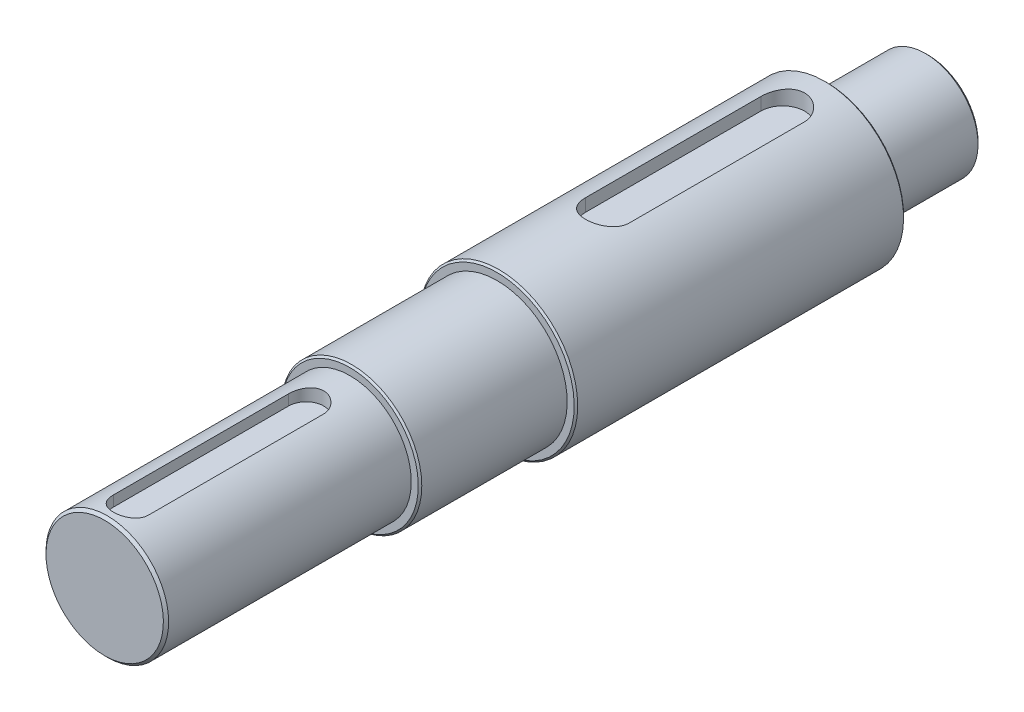
ISO-10303-21;
HEADER;
FILE_DESCRIPTION(('STEP AP214'),'2;1');
FILE_NAME('part.step','',(''),(''),'','','');
FILE_SCHEMA(('AUTOMOTIVE_DESIGN { 1 0 10303 214 1 1 1 1 }'));
ENDSEC;
DATA;
#1=APPLICATION_CONTEXT('core data for automotive mechanical design processes');
#2=APPLICATION_PROTOCOL_DEFINITION('international standard','automotive_design',2000,#1);
#3=PRODUCT_CONTEXT('',#1,'mechanical');
#4=PRODUCT('Part','Part','',(#3));
#5=PRODUCT_RELATED_PRODUCT_CATEGORY('part','',(#4));
#6=PRODUCT_DEFINITION_FORMATION('','',#4);
#7=PRODUCT_DEFINITION_CONTEXT('part definition',#1,'design');
#8=PRODUCT_DEFINITION('design','',#6,#7);
#9=PRODUCT_DEFINITION_SHAPE('','',#8);
#10=(LENGTH_UNIT() NAMED_UNIT(*) SI_UNIT(.MILLI.,.METRE.));
#11=(NAMED_UNIT(*) PLANE_ANGLE_UNIT() SI_UNIT($,.RADIAN.));
#12=(NAMED_UNIT(*) SI_UNIT($,.STERADIAN.) SOLID_ANGLE_UNIT());
#13=UNCERTAINTY_MEASURE_WITH_UNIT(LENGTH_MEASURE(1.E-05),#10,'distance_accuracy_value','');
#14=(GEOMETRIC_REPRESENTATION_CONTEXT(3) GLOBAL_UNCERTAINTY_ASSIGNED_CONTEXT((#13)) GLOBAL_UNIT_ASSIGNED_CONTEXT((#10,
#11,#12)) REPRESENTATION_CONTEXT('',''));
#15=CARTESIAN_POINT('',(0.,0.,0.));
#16=DIRECTION('',(0.,0.,1.));
#17=DIRECTION('',(1.,0.,0.));
#18=AXIS2_PLACEMENT_3D('',#15,#16,#17);
#19=CARTESIAN_POINT('',(0.,0.,-470.));
#20=DIRECTION('',(0.,0.,-1.));
#21=DIRECTION('',(0.,1.,0.));
#22=AXIS2_PLACEMENT_3D('',#19,#20,#21);
#23=CYLINDRICAL_SURFACE('',#22,44.9999999999999);
#24=CARTESIAN_POINT('',(0.,0.,-411.));
#25=DIRECTION('',(0.,0.,-1.));
#26=DIRECTION('',(0.,1.,0.));
#27=AXIS2_PLACEMENT_3D('',#24,#25,#26);
#28=CIRCLE('',#27,44.9999999999999);
#29=CARTESIAN_POINT('',(0.,45.,-411.));
#30=VERTEX_POINT('',#29);
#31=EDGE_CURVE('E301',#30,#30,#28,.F.);
#32=ORIENTED_EDGE('',*,*,#31,.T.);
#33=EDGE_LOOP('',(#32));
#34=FACE_BOUND('',#33,.T.);
#35=CARTESIAN_POINT('',(0.,0.,-225.));
#36=DIRECTION('',(0.,0.,1.));
#37=DIRECTION('',(0.,-1.,0.));
#38=AXIS2_PLACEMENT_3D('',#35,#36,#37);
#39=CIRCLE('',#38,44.9999999999999);
#40=CARTESIAN_POINT('',(0.,-44.9999999999999,-225.));
#41=VERTEX_POINT('',#40);
#42=EDGE_CURVE('E297',#41,#41,#39,.F.);
#43=ORIENTED_EDGE('',*,*,#42,.T.);
#44=EDGE_LOOP('',(#43));
#45=FACE_BOUND('',#44,.T.);
#46=DIRECTION('',(0.,0.,-1.));
#47=VECTOR('',#46,1.);
#48=CARTESIAN_POINT('',(-12.5,43.2290411644764,-470.));
#49=LINE('',#48,#47);
#50=CARTESIAN_POINT('',(-12.5,43.2290411644764,-287.));
#51=VERTEX_POINT('',#50);
#52=CARTESIAN_POINT('',(-12.5,43.2290411644764,-387.));
#53=VERTEX_POINT('',#52);
#54=EDGE_CURVE('E253',#51,#53,#49,.T.);
#55=ORIENTED_EDGE('',*,*,#54,.T.);
#56=CARTESIAN_POINT('',(-12.5,43.2290411644764,-387.));
#57=CARTESIAN_POINT('',(-12.500045240691,43.2289961808989,-387.344286160492));
#58=CARTESIAN_POINT('',(-12.4857780852814,43.2331526093881,-387.688556281799));
#59=CARTESIAN_POINT('',(-12.4289529612534,43.2495403215527,-388.374494130724));
#60=CARTESIAN_POINT('',(-12.3864005976549,43.261770005422,-388.716162360369));
#61=CARTESIAN_POINT('',(-12.2734671845474,43.2939399271419,-389.393694228693));
#62=CARTESIAN_POINT('',(-12.2031495583828,43.3138625898821,-389.729569288213));
#63=CARTESIAN_POINT('',(-12.0353031723932,43.3608015819289,-390.393943528582));
#64=CARTESIAN_POINT('',(-11.9377738607429,43.3878180550901,-390.722442559706));
#65=CARTESIAN_POINT('',(-11.7163375218914,43.4481365646167,-391.369715045171));
#66=CARTESIAN_POINT('',(-11.5924382803264,43.4814367454096,-391.688491338428));
#67=CARTESIAN_POINT('',(-11.3192063982575,43.5533639847889,-392.314335168257));
#68=CARTESIAN_POINT('',(-11.1698726730095,43.5919912705554,-392.621402204762));
#69=CARTESIAN_POINT('',(-10.8468207159485,43.6734956770882,-393.221959321005));
#70=CARTESIAN_POINT('',(-10.6730947977984,43.7163741362051,-393.515445082174));
#71=CARTESIAN_POINT('',(-10.3024966888676,43.8051921305476,-394.086928305757));
#72=CARTESIAN_POINT('',(-10.1056241324873,43.8511317141186,-394.364925523428));
#73=CARTESIAN_POINT('',(-9.68499948312222,43.9459709868199,-394.910259724889));
#74=CARTESIAN_POINT('',(-9.46071276593183,43.994915382457,-395.177176708216));
#75=CARTESIAN_POINT('',(-8.99059673451083,44.0933879144002,-395.691408820648));
#76=CARTESIAN_POINT('',(-8.74475811115383,44.1429162948785,-395.938715390523));
#77=CARTESIAN_POINT('',(-8.23315305431616,44.2411916236806,-396.412048421034));
#78=CARTESIAN_POINT('',(-7.9673830944861,44.2899384318642,-396.638071099988));
#79=CARTESIAN_POINT('',(-7.4177678485958,44.3852955993302,-397.06718531759));
#80=CARTESIAN_POINT('',(-7.13393069608662,44.431906903954,-397.270287062261));
#81=CARTESIAN_POINT('',(-6.54469120547241,44.5225495873953,-397.655661925901));
#82=CARTESIAN_POINT('',(-6.23899530592892,44.5665204111392,-397.83750084439));
#83=CARTESIAN_POINT('',(-5.61270553474492,44.6497179492803,-398.174704569497));
#84=CARTESIAN_POINT('',(-5.29211143501657,44.6889445910121,-398.330068970626));
#85=CARTESIAN_POINT('',(-4.6383234515605,44.7615247379244,-398.613044657932));
#86=CARTESIAN_POINT('',(-4.30513194450377,44.7948793442934,-398.740661148757));
#87=CARTESIAN_POINT('',(-3.62850440804102,44.8547576556818,-398.967088939055));
#88=CARTESIAN_POINT('',(-3.2850686767247,44.8812815592472,-399.065901075786));
#89=CARTESIAN_POINT('',(-2.59911476303481,44.926159441948,-399.231762663092));
#90=CARTESIAN_POINT('',(-2.25678402117027,44.9446992827699,-399.299537333787));
#91=CARTESIAN_POINT('',(-1.56732778649449,44.9740205084003,-399.406254879431));
#92=CARTESIAN_POINT('',(-1.22020236522849,44.9848020088499,-399.445198184122));
#93=CARTESIAN_POINT('',(-0.523800772346508,44.9982989216423,-399.493896688356));
#94=CARTESIAN_POINT('',(-0.174524898752593,45.0010154275398,-399.503655845058));
#95=CARTESIAN_POINT('',(0.523583603734409,44.9983076700296,-399.493907196579));
#96=CARTESIAN_POINT('',(0.872416239430775,44.9928835331213,-399.474399846177));
#97=CARTESIAN_POINT('',(1.55748614050236,44.9743086194663,-399.407233245157));
#98=CARTESIAN_POINT('',(1.89380666555369,44.9613735804177,-399.360359840037));
#99=CARTESIAN_POINT('',(2.56117121562254,44.9282986410243,-399.239501380676));
#100=CARTESIAN_POINT('',(2.8922153535257,44.9081588950373,-399.165516907278));
#101=CARTESIAN_POINT('',(3.54676340808957,44.8612097813299,-398.991046435018));
#102=CARTESIAN_POINT('',(3.87026713210312,44.8344002434093,-398.890559759868));
#103=CARTESIAN_POINT('',(4.50757291428368,44.7748168949959,-398.66388347612));
#104=CARTESIAN_POINT('',(4.82137480937625,44.7420429843139,-398.537693435754));
#105=CARTESIAN_POINT('',(5.44048981249991,44.6710105665636,-398.259107811735));
#106=CARTESIAN_POINT('',(5.7456789641549,44.6326980122368,-398.106450627146));
#107=CARTESIAN_POINT('',(6.342137185888,44.5518561477928,-397.776983763343));
#108=CARTESIAN_POINT('',(6.63340620193641,44.5093268213106,-397.600173990393));
#109=CARTESIAN_POINT('',(7.20020650483161,44.4211581633888,-397.223638328208));
#110=CARTESIAN_POINT('',(7.4757387403595,44.375519019787,-397.023913822562));
#111=CARTESIAN_POINT('',(8.00953143724535,44.2822860937902,-396.602762094549));
#112=CARTESIAN_POINT('',(8.26778398256613,44.234691431446,-396.38132503838));
#113=CARTESIAN_POINT('',(8.77357773969799,44.1372049033222,-395.910534279091));
#114=CARTESIAN_POINT('',(9.02047977213161,44.0872891973234,-395.660498339081));
#115=CARTESIAN_POINT('',(9.49232627225081,43.9881103893933,-395.140573423772));
#116=CARTESIAN_POINT('',(9.71727958845004,43.9388470314518,-394.87069252646));
#117=CARTESIAN_POINT('',(10.1439446349555,43.8423113827873,-394.312580255748));
#118=CARTESIAN_POINT('',(10.3456443446517,43.7950401297931,-394.024339509954));
#119=CARTESIAN_POINT('',(10.7242436999143,43.7038731079755,-393.43150746412));
#120=CARTESIAN_POINT('',(10.9011441061178,43.659977235642,-393.126916665961));
#121=CARTESIAN_POINT('',(11.2301161302556,43.5765250003751,-392.500951917571));
#122=CARTESIAN_POINT('',(11.3819835257626,43.5370051189538,-392.179465679369));
#123=CARTESIAN_POINT('',(11.6579768534934,43.46391571385,-391.524153528085));
#124=CARTESIAN_POINT('',(11.7821041000084,43.4303459082764,-391.190328200487));
#125=CARTESIAN_POINT('',(12.0014315261798,43.3702499023691,-390.513140713505));
#126=CARTESIAN_POINT('',(12.0966669494724,43.3437151253935,-390.169790735606));
#127=CARTESIAN_POINT('',(12.2575243340772,43.298499567937,-389.475859533639));
#128=CARTESIAN_POINT('',(12.3231600492767,43.2798151399661,-389.125281747421));
#129=CARTESIAN_POINT('',(12.4157443037831,43.2533383842448,-388.478912580948));
#130=CARTESIAN_POINT('',(12.4473450618982,43.2442420695325,-388.183831836571));
#131=CARTESIAN_POINT('',(12.4894673764403,43.2320864061189,-387.592508557323));
#132=CARTESIAN_POINT('',(12.5000216233051,43.2290176951694,-387.296268541427));
#133=CARTESIAN_POINT('',(12.5,43.2290411644764,-387.));
#134=B_SPLINE_CURVE_WITH_KNOTS('',3,(#56,#57,#58,#59,#60,#61,#62,#63,#64,#65,#66,#67,#68,#69,
#70,#71,#72,#73,#74,#75,#76,#77,#78,#79,#80,#81,#82,#83,#84,#85,#86,#87,#88,#89,#90,#91,#92,#93,
#94,#95,#96,#97,#98,#99,#100,#101,#102,#103,#104,#105,#106,#107,#108,#109,#110,#111,#112,#113,
#114,#115,#116,#117,#118,#119,#120,#121,#122,#123,#124,#125,#126,#127,#128,#129,#130,#131,#132,
#133),.UNSPECIFIED.,.F.,.F.,(4,2,2,2,2,2,2,2,2,2,2,2,2,2,2,2,2,2,2,2,2,2,2,2,2,2,2,2,2,2,2,2,2,
2,2,2,2,2,4),(0.,1.03251330399437,2.06482206528686,3.0947862714934,4.12477136583919,
5.15445278123941,6.18417812207147,7.21422867572854,8.24429550115863,9.29925646517971,
10.3546753754125,11.4102814580527,12.4654156399844,13.5392973658636,14.6131955380308,
15.6868921060273,16.7605574616778,17.8076646923354,18.854756315115,19.9017059533918,
20.948639323032,21.966892519181,22.985123900993,24.0033812687566,25.0216557427343,
26.0506374539943,27.0796231588262,28.1085467663373,29.1379385539288,30.2014657415118,
31.2645623864265,32.3282061425056,33.3918172676643,34.4637166658526,35.5355652681109,
36.6061010712407,37.6761389222234,38.5660706036811,39.4546189210757),.UNSPECIFIED.);
#135=CARTESIAN_POINT('',(12.5,43.2290411644764,-387.));
#136=VERTEX_POINT('',#135);
#137=EDGE_CURVE('E120',#53,#136,#134,.T.);
#138=ORIENTED_EDGE('',*,*,#137,.T.);
#139=DIRECTION('',(0.,0.,-1.));
#140=VECTOR('',#139,1.);
#141=CARTESIAN_POINT('',(12.5,43.2290411644764,-470.));
#142=LINE('',#141,#140);
#143=CARTESIAN_POINT('',(12.5,43.2290411644764,-287.));
#144=VERTEX_POINT('',#143);
#145=EDGE_CURVE('E239',#136,#144,#142,.F.);
#146=ORIENTED_EDGE('',*,*,#145,.T.);
#147=CARTESIAN_POINT('',(12.5,43.2290411644764,-287.));
#148=CARTESIAN_POINT('',(12.500045240691,43.2289961808989,-286.655713839508));
#149=CARTESIAN_POINT('',(12.4857780852814,43.233152609388,-286.311443718201));
#150=CARTESIAN_POINT('',(12.4289529612535,43.2495403215527,-285.625505869276));
#151=CARTESIAN_POINT('',(12.3864005976549,43.261770005422,-285.283837639631));
#152=CARTESIAN_POINT('',(12.2734671845474,43.2939399271419,-284.606305771308));
#153=CARTESIAN_POINT('',(12.2031495583829,43.3138625898821,-284.270430711787));
#154=CARTESIAN_POINT('',(12.0353031723932,43.3608015819289,-283.606056471418));
#155=CARTESIAN_POINT('',(11.9377738607429,43.3878180550901,-283.277557440294));
#156=CARTESIAN_POINT('',(11.7163375218914,43.4481365646167,-282.630284954829));
#157=CARTESIAN_POINT('',(11.5924382803264,43.4814367454095,-282.311508661572));
#158=CARTESIAN_POINT('',(11.3192063982575,43.5533639847889,-281.685664831743));
#159=CARTESIAN_POINT('',(11.1698726730095,43.5919912705554,-281.378597795238));
#160=CARTESIAN_POINT('',(10.8468207159485,43.6734956770882,-280.778040678995));
#161=CARTESIAN_POINT('',(10.6730947977984,43.7163741362051,-280.484554917826));
#162=CARTESIAN_POINT('',(10.3024966888677,43.8051921305476,-279.913071694243));
#163=CARTESIAN_POINT('',(10.1056241324873,43.8511317141186,-279.635074476572));
#164=CARTESIAN_POINT('',(9.68499948312223,43.9459709868199,-279.089740275111));
#165=CARTESIAN_POINT('',(9.46071276593185,43.994915382457,-278.822823291784));
#166=CARTESIAN_POINT('',(8.99059673451084,44.0933879144002,-278.308591179352));
#167=CARTESIAN_POINT('',(8.74475811115383,44.1429162948785,-278.061284609477));
#168=CARTESIAN_POINT('',(8.23315305431618,44.2411916236805,-277.587951578966));
#169=CARTESIAN_POINT('',(7.96738309448614,44.2899384318641,-277.361928900012));
#170=CARTESIAN_POINT('',(7.41776784859583,44.3852955993301,-276.93281468241));
#171=CARTESIAN_POINT('',(7.13393069608664,44.4319069039539,-276.729712937739));
#172=CARTESIAN_POINT('',(6.54469120547242,44.5225495873953,-276.344338074099));
#173=CARTESIAN_POINT('',(6.23899530592894,44.5665204111392,-276.16249915561));
#174=CARTESIAN_POINT('',(5.61270553474493,44.6497179492803,-275.825295430503));
#175=CARTESIAN_POINT('',(5.29211143501659,44.6889445910121,-275.669931029374));
#176=CARTESIAN_POINT('',(4.63832345156052,44.7615247379244,-275.386955342068));
#177=CARTESIAN_POINT('',(4.3051319445038,44.7948793442933,-275.259338851243));
#178=CARTESIAN_POINT('',(3.62850440804105,44.8547576556817,-275.032911060945));
#179=CARTESIAN_POINT('',(3.28506867672473,44.8812815592472,-274.934098924214));
#180=CARTESIAN_POINT('',(2.59911476303484,44.926159441948,-274.768237336908));
#181=CARTESIAN_POINT('',(2.2567840211703,44.9446992827699,-274.700462666213));
#182=CARTESIAN_POINT('',(1.56732778649452,44.9740205084003,-274.59374512057));
#183=CARTESIAN_POINT('',(1.22020236522852,44.9848020088498,-274.554801815878));
#184=CARTESIAN_POINT('',(0.523800772346536,44.9982989216422,-274.506103311644));
#185=CARTESIAN_POINT('',(0.174524898752619,45.0010154275397,-274.496344154942));
#186=CARTESIAN_POINT('',(-0.523583603734387,44.9983076700296,-274.506092803421));
#187=CARTESIAN_POINT('',(-0.872416239430753,44.9928835331213,-274.525600153823));
#188=CARTESIAN_POINT('',(-1.55748614050236,44.9743086194663,-274.592766754843));
#189=CARTESIAN_POINT('',(-1.8938066655537,44.9613735804177,-274.639640159963));
#190=CARTESIAN_POINT('',(-2.56117121562255,44.9282986410243,-274.760498619324));
#191=CARTESIAN_POINT('',(-2.89221535352571,44.9081588950373,-274.834483092722));
#192=CARTESIAN_POINT('',(-3.54676340808956,44.8612097813299,-275.008953564982));
#193=CARTESIAN_POINT('',(-3.87026713210311,44.8344002434093,-275.109440240132));
#194=CARTESIAN_POINT('',(-4.50757291428366,44.7748168949959,-275.33611652388));
#195=CARTESIAN_POINT('',(-4.82137480937624,44.7420429843139,-275.462306564246));
#196=CARTESIAN_POINT('',(-5.44048981249989,44.6710105665636,-275.740892188265));
#197=CARTESIAN_POINT('',(-5.74567896415488,44.6326980122368,-275.893549372854));
#198=CARTESIAN_POINT('',(-6.34213718588799,44.5518561477928,-276.223016236657));
#199=CARTESIAN_POINT('',(-6.6334062019364,44.5093268213105,-276.399826009607));
#200=CARTESIAN_POINT('',(-7.20020650483159,44.4211581633888,-276.776361671792));
#201=CARTESIAN_POINT('',(-7.47573874035949,44.375519019787,-276.976086177439));
#202=CARTESIAN_POINT('',(-8.00953143724534,44.2822860937902,-277.397237905451));
#203=CARTESIAN_POINT('',(-8.26778398256612,44.234691431446,-277.61867496162));
#204=CARTESIAN_POINT('',(-8.77357773969798,44.1372049033222,-278.089465720909));
#205=CARTESIAN_POINT('',(-9.02047977213159,44.0872891973234,-278.339501660919));
#206=CARTESIAN_POINT('',(-9.49232627225079,43.9881103893933,-278.859426576228));
#207=CARTESIAN_POINT('',(-9.71727958845003,43.9388470314518,-279.12930747354));
#208=CARTESIAN_POINT('',(-10.1439446349555,43.8423113827873,-279.687419744252));
#209=CARTESIAN_POINT('',(-10.3456443446518,43.7950401297931,-279.975660490046));
#210=CARTESIAN_POINT('',(-10.7242436999144,43.7038731079755,-280.56849253588));
#211=CARTESIAN_POINT('',(-10.9011441061179,43.659977235642,-280.873083334039));
#212=CARTESIAN_POINT('',(-11.2301161302556,43.5765250003751,-281.499048082429));
#213=CARTESIAN_POINT('',(-11.3819835257626,43.5370051189538,-281.820534320631));
#214=CARTESIAN_POINT('',(-11.6579768534934,43.4639157138499,-282.475846471915));
#215=CARTESIAN_POINT('',(-11.7821041000084,43.4303459082764,-282.809671799513));
#216=CARTESIAN_POINT('',(-12.0014315261798,43.370249902369,-283.486859286495));
#217=CARTESIAN_POINT('',(-12.0966669494724,43.3437151253935,-283.830209264394));
#218=CARTESIAN_POINT('',(-12.2575243340772,43.298499567937,-284.524140466361));
#219=CARTESIAN_POINT('',(-12.3231600492767,43.2798151399661,-284.874718252579));
#220=CARTESIAN_POINT('',(-12.4157443037831,43.2533383842448,-285.521087419052));
#221=CARTESIAN_POINT('',(-12.4473450618982,43.2442420695325,-285.816168163429));
#222=CARTESIAN_POINT('',(-12.4894673764403,43.2320864061189,-286.407491442677));
#223=CARTESIAN_POINT('',(-12.5000216233051,43.2290176951694,-286.703731458573));
#224=CARTESIAN_POINT('',(-12.5,43.2290411644764,-287.));
#225=B_SPLINE_CURVE_WITH_KNOTS('',3,(#147,#148,#149,#150,#151,#152,#153,#154,#155,#156,#157,
#158,#159,#160,#161,#162,#163,#164,#165,#166,#167,#168,#169,#170,#171,#172,#173,#174,#175,#176,
#177,#178,#179,#180,#181,#182,#183,#184,#185,#186,#187,#188,#189,#190,#191,#192,#193,#194,#195,
#196,#197,#198,#199,#200,#201,#202,#203,#204,#205,#206,#207,#208,#209,#210,#211,#212,#213,#214,
#215,#216,#217,#218,#219,#220,#221,#222,#223,#224),.UNSPECIFIED.,.F.,.F.,(4,2,2,2,2,2,2,2,2,2,2,
2,2,2,2,2,2,2,2,2,2,2,2,2,2,2,2,2,2,2,2,2,2,2,2,2,2,2,4),(0.,1.03251330399437,2.06482206528681,
3.09478627149341,4.12477136583919,5.15445278123941,6.18417812207147,7.21422867572854,
8.24429550115863,9.29925646517971,10.3546753754125,11.4102814580526,12.4654156399844,
13.5392973658636,14.6131955380308,15.6868921060273,16.7605574616778,17.8076646923354,
18.854756315115,19.9017059533918,20.948639323032,21.966892519181,22.985123900993,
24.0033812687566,25.0216557427343,26.0506374539943,27.0796231588262,28.1085467663373,
29.1379385539288,30.2014657415118,31.2645623864265,32.3282061425058,33.3918172676643,
34.4637166658526,35.535565268111,36.6061010712408,37.6761389222234,38.5660706036811,
39.4546189210757),.UNSPECIFIED.);
#226=EDGE_CURVE('E243',#144,#51,#225,.T.);
#227=ORIENTED_EDGE('',*,*,#226,.T.);
#228=EDGE_LOOP('',(#55,#138,#146,#227));
#229=FACE_BOUND('',#228,.T.);
#230=ADVANCED_FACE('F46',(#34,#45,#229),#23,.T.);
#231=CARTESIAN_POINT('',(0.,0.,-470.));
#232=DIRECTION('',(0.,0.,-1.));
#233=DIRECTION('',(0.,1.,0.));
#234=AXIS2_PLACEMENT_3D('',#231,#232,#233);
#235=CYLINDRICAL_SURFACE('',#234,34.9999999999999);
#236=CARTESIAN_POINT('',(0.,0.,-1.5));
#237=DIRECTION('',(0.,0.,1.));
#238=DIRECTION('',(0.,-1.,0.));
#239=AXIS2_PLACEMENT_3D('',#236,#237,#238);
#240=CIRCLE('',#239,34.9999999999999);
#241=CARTESIAN_POINT('',(0.,-34.9999999999999,-1.50000000000001));
#242=VERTEX_POINT('',#241);
#243=EDGE_CURVE('E277',#242,#242,#240,.F.);
#244=ORIENTED_EDGE('',*,*,#243,.T.);
#245=EDGE_LOOP('',(#244));
#246=FACE_BOUND('',#245,.T.);
#247=CARTESIAN_POINT('',(0.,0.,-140.));
#248=DIRECTION('',(0.,0.,-1.));
#249=DIRECTION('',(0.,1.,0.));
#250=AXIS2_PLACEMENT_3D('',#247,#248,#249);
#251=CIRCLE('',#250,34.9999999999999);
#252=CARTESIAN_POINT('',(0.,35.,-140.));
#253=VERTEX_POINT('',#252);
#254=EDGE_CURVE('E188',#253,#253,#251,.T.);
#255=ORIENTED_EDGE('',*,*,#254,.F.);
#256=EDGE_LOOP('',(#255));
#257=FACE_BOUND('',#256,.T.);
#258=DIRECTION('',(0.,0.,-1.));
#259=VECTOR('',#258,1.);
#260=CARTESIAN_POINT('',(10.,33.5410196624969,-470.));
#261=LINE('',#260,#259);
#262=CARTESIAN_POINT('',(10.,33.5410196624968,-115.));
#263=VERTEX_POINT('',#262);
#264=CARTESIAN_POINT('',(10.,33.5410196624968,-15.));
#265=VERTEX_POINT('',#264);
#266=EDGE_CURVE('E206',#263,#265,#261,.F.);
#267=ORIENTED_EDGE('',*,*,#266,.T.);
#268=CARTESIAN_POINT('',(10.,33.5410196624968,-15.));
#269=CARTESIAN_POINT('',(10.0000365360893,33.54098247272,-14.7249127810088));
#270=CARTESIAN_POINT('',(9.98865070675197,33.5444026068776,-14.4498389133691));
#271=CARTESIAN_POINT('',(9.94330432826118,33.5578862384899,-13.9017774639889));
#272=CARTESIAN_POINT('',(9.90934846024636,33.5679483583607,-13.6287894615026));
#273=CARTESIAN_POINT('',(9.81923831824626,33.594413604027,-13.0874834060345));
#274=CARTESIAN_POINT('',(9.76313664788186,33.6108017015026,-12.8191558484344));
#275=CARTESIAN_POINT('',(9.62923263708805,33.6494095200446,-12.288399617897));
#276=CARTESIAN_POINT('',(9.55142981256278,33.6716293712014,-12.0259710766924));
#277=CARTESIAN_POINT('',(9.37481209906698,33.7212290569954,-11.5089405933097));
#278=CARTESIAN_POINT('',(9.27600781522333,33.7486062865156,-11.254334774878));
#279=CARTESIAN_POINT('',(9.0580984479372,33.8077446180219,-10.754385756679));
#280=CARTESIAN_POINT('',(8.93898584406154,33.8395073431818,-10.5090460295259));
#281=CARTESIAN_POINT('',(8.68134043949089,33.9065191207982,-10.0292362794943));
#282=CARTESIAN_POINT('',(8.54280444976228,33.9417687454718,-9.79476804998468));
#283=CARTESIAN_POINT('',(8.24727956170075,34.0147841313153,-9.33816800023741));
#284=CARTESIAN_POINT('',(8.09028972082816,34.0525500209621,-9.11603681097422));
#285=CARTESIAN_POINT('',(7.75460900510779,34.1305798802947,-8.67989692488147));
#286=CARTESIAN_POINT('',(7.57546276900981,34.1708831608799,-8.46624560930283));
#287=CARTESIAN_POINT('',(7.20001350476826,34.2519587918207,-8.0546853989937));
#288=CARTESIAN_POINT('',(7.0037102334069,34.2927311488189,-7.85677672750662));
#289=CARTESIAN_POINT('',(6.59516291750775,34.3736408909464,-7.47793605974615));
#290=CARTESIAN_POINT('',(6.38291601516098,34.4137781606714,-7.29700712013294));
#291=CARTESIAN_POINT('',(5.94385936590823,34.4923217776482,-6.95337038582844));
#292=CARTESIAN_POINT('',(5.71705003180524,34.5307281739126,-6.79066207499329));
#293=CARTESIAN_POINT('',(5.24589340555308,34.6054699464445,-6.4816991577943));
#294=CARTESIAN_POINT('',(5.00129596788592,34.6417525803368,-6.33581288348409));
#295=CARTESIAN_POINT('',(4.50021525068414,34.7104015648878,-6.06528702085663));
#296=CARTESIAN_POINT('',(4.24373662766712,34.7427694321741,-5.94063919680754));
#297=CARTESIAN_POINT('',(3.72058575986785,34.8026802322955,-5.71352833612047));
#298=CARTESIAN_POINT('',(3.45391344054172,34.8302231298385,-5.61106546175186));
#299=CARTESIAN_POINT('',(2.91230878338613,34.8796844486166,-5.42920841691421));
#300=CARTESIAN_POINT('',(2.63737670067014,34.9016030433664,-5.34981353476701));
#301=CARTESIAN_POINT('',(2.08857017737901,34.9386824573288,-5.21656915698949));
#302=CARTESIAN_POINT('',(1.81485525332598,34.9540046534083,-5.16210727787233));
#303=CARTESIAN_POINT('',(1.2635532068249,34.9782725964626,-5.07622777828681));
#304=CARTESIAN_POINT('',(0.985966145364854,34.9872184437524,-5.04480979528275));
#305=CARTESIAN_POINT('',(0.429042577413925,34.998478311528,-5.00530924476795));
#306=CARTESIAN_POINT('',(0.149706329346248,35.0007932895184,-4.99722330808354));
#307=CARTESIAN_POINT('',(-0.40863588853731,34.9987278194399,-5.00445287506904));
#308=CARTESIAN_POINT('',(-0.687641863730134,34.9943474819158,-5.01976799236952));
#309=CARTESIAN_POINT('',(-1.23515924205468,34.9792396768169,-5.07287404914875));
#310=CARTESIAN_POINT('',(-1.503740537151,34.9686997350483,-5.11000110552604));
#311=CARTESIAN_POINT('',(-2.03670936087621,34.9417087498088,-5.20586278135903));
#312=CARTESIAN_POINT('',(-2.30109698443278,34.9252578403382,-5.26459691098824));
#313=CARTESIAN_POINT('',(-2.82382541600096,34.8868841581542,-5.40317170222478));
#314=CARTESIAN_POINT('',(-3.08216716413866,34.8649622424428,-5.48300905824763));
#315=CARTESIAN_POINT('',(-3.59122625345116,34.8162103963016,-5.6631897253718));
#316=CARTESIAN_POINT('',(-3.84194064326846,34.7893785934989,-5.76354086106649));
#317=CARTESIAN_POINT('',(-4.33662254761107,34.7312018919979,-5.98512734666462));
#318=CARTESIAN_POINT('',(-4.58049139181083,34.6998125025794,-6.10657120910416));
#319=CARTESIAN_POINT('',(-5.05725829801619,34.6335400843055,-6.36876671330163));
#320=CARTESIAN_POINT('',(-5.29015142117992,34.5986555043473,-6.50952693764787));
#321=CARTESIAN_POINT('',(-5.74345927995585,34.5262997215507,-6.80936294046598));
#322=CARTESIAN_POINT('',(-5.96387199506769,34.4888281020535,-6.96844167201534));
#323=CARTESIAN_POINT('',(-6.39076242941754,34.4122822535692,-7.30378009179716));
#324=CARTESIAN_POINT('',(-6.59724581781993,34.3732086871039,-7.48003271807333));
#325=CARTESIAN_POINT('',(-7.00219950736255,34.2930504133063,-7.85520751821862));
#326=CARTESIAN_POINT('',(-7.20012664060527,34.2519435020111,-8.05471165779787));
#327=CARTESIAN_POINT('',(-7.57847708088304,34.1702230234805,-8.46964839264521));
#328=CARTESIAN_POINT('',(-7.75890608103355,34.1296092995715,-8.68507576672984));
#329=CARTESIAN_POINT('',(-8.10121311351374,34.0499816296952,-9.13064669405762));
#330=CARTESIAN_POINT('',(-8.26308221533716,34.0109684596197,-9.36079724939852));
#331=CARTESIAN_POINT('',(-8.56702972033075,33.9356821733109,-9.83423480835211));
#332=CARTESIAN_POINT('',(-8.70910872273119,33.8994089741284,-10.0775214139048));
#333=CARTESIAN_POINT('',(-8.9735591116493,33.8303722143044,-10.5777868279535));
#334=CARTESIAN_POINT('',(-9.09575063013379,33.7976414958781,-10.834865341987));
#335=CARTESIAN_POINT('',(-9.31794179575966,33.7370601860414,-11.3589876413826));
#336=CARTESIAN_POINT('',(-9.41794255412977,33.7092093502798,-11.6260309269642));
#337=CARTESIAN_POINT('',(-9.59478968632395,33.6592997079517,-12.1678420297319));
#338=CARTESIAN_POINT('',(-9.6716643377374,33.6372338320701,-12.4425999603967));
#339=CARTESIAN_POINT('',(-9.80169669852144,33.5995731264666,-12.9979910894266));
#340=CARTESIAN_POINT('',(-9.85486539589321,33.5839752989598,-13.2786215025414));
#341=CARTESIAN_POINT('',(-9.93057481078496,33.5616603042315,-13.7993302288439));
#342=CARTESIAN_POINT('',(-9.95661201264007,33.5539337882269,-14.0388632596658));
#343=CARTESIAN_POINT('',(-9.99132081128702,33.5436069779551,-14.5189245894223));
#344=CARTESIAN_POINT('',(-10.0000188938676,33.5409988653377,-14.7594508071364));
#345=CARTESIAN_POINT('',(-10.,33.5410196624968,-15.));
#346=B_SPLINE_CURVE_WITH_KNOTS('',3,(#268,#269,#270,#271,#272,#273,#274,#275,#276,#277,#278,
#279,#280,#281,#282,#283,#284,#285,#286,#287,#288,#289,#290,#291,#292,#293,#294,#295,#296,#297,
#298,#299,#300,#301,#302,#303,#304,#305,#306,#307,#308,#309,#310,#311,#312,#313,#314,#315,#316,
#317,#318,#319,#320,#321,#322,#323,#324,#325,#326,#327,#328,#329,#330,#331,#332,#333,#334,#335,
#336,#337,#338,#339,#340,#341,#342,#343,#344,#345),.UNSPECIFIED.,.F.,.F.,(4,2,2,2,2,2,2,2,2,2,2,
2,2,2,2,2,2,2,2,2,2,2,2,2,2,2,2,2,2,2,2,2,2,2,2,2,2,2,4),(0.,0.824984357624062,1.64979766274565,
2.4726634396547,3.29554757401041,4.1180171587957,4.94079197884896,5.76370204493683,
6.58665415984561,7.4308368232243,8.27503145566178,9.11937776812351,9.96370015635821,
10.8239516934824,11.6838688839443,12.5437923639629,13.4036893113833,14.2411536565694,
15.0786048261527,15.9159350607945,16.7532514706184,17.5663142232641,18.379358545133,
19.1922755880901,20.0055032833981,20.8272825171044,21.6494280707064,22.4717063462234,
23.2936479140539,24.1447133665263,24.995500984547,25.8466962750066,26.6978657862673,
27.5563505279373,28.4147922702562,29.2721800407936,30.1291699873618,30.8517080106868,
31.5731414970245),.UNSPECIFIED.);
#347=CARTESIAN_POINT('',(-10.,33.5410196624968,-15.));
#348=VERTEX_POINT('',#347);
#349=EDGE_CURVE('E231',#265,#348,#346,.T.);
#350=ORIENTED_EDGE('',*,*,#349,.T.);
#351=DIRECTION('',(0.,0.,-1.));
#352=VECTOR('',#351,1.);
#353=CARTESIAN_POINT('',(-10.,33.5410196624969,-470.));
#354=LINE('',#353,#352);
#355=CARTESIAN_POINT('',(-10.,33.5410196624968,-115.));
#356=VERTEX_POINT('',#355);
#357=EDGE_CURVE('E192',#348,#356,#354,.T.);
#358=ORIENTED_EDGE('',*,*,#357,.T.);
#359=CARTESIAN_POINT('',(-10.,33.5410196624968,-115.));
#360=CARTESIAN_POINT('',(-10.0000365360893,33.54098247272,-115.275087218991));
#361=CARTESIAN_POINT('',(-9.98865070675197,33.5444026068776,-115.550161086631));
#362=CARTESIAN_POINT('',(-9.94330432826118,33.55788623849,-116.098222536011));
#363=CARTESIAN_POINT('',(-9.90934846024636,33.5679483583608,-116.371210538497));
#364=CARTESIAN_POINT('',(-9.81923831824626,33.594413604027,-116.912516593966));
#365=CARTESIAN_POINT('',(-9.76313664788186,33.6108017015026,-117.180844151566));
#366=CARTESIAN_POINT('',(-9.62923263708805,33.6494095200446,-117.711600382103));
#367=CARTESIAN_POINT('',(-9.55142981256278,33.6716293712014,-117.974028923308));
#368=CARTESIAN_POINT('',(-9.37481209906698,33.7212290569954,-118.49105940669));
#369=CARTESIAN_POINT('',(-9.27600781522333,33.7486062865157,-118.745665225122));
#370=CARTESIAN_POINT('',(-9.0580984479372,33.8077446180219,-119.245614243321));
#371=CARTESIAN_POINT('',(-8.93898584406154,33.8395073431818,-119.490953970474));
#372=CARTESIAN_POINT('',(-8.68134043949089,33.9065191207982,-119.970763720506));
#373=CARTESIAN_POINT('',(-8.54280444976228,33.9417687454718,-120.205231950015));
#374=CARTESIAN_POINT('',(-8.24727956170076,34.0147841313153,-120.661831999763));
#375=CARTESIAN_POINT('',(-8.09028972082816,34.0525500209621,-120.883963189026));
#376=CARTESIAN_POINT('',(-7.75460900510779,34.1305798802947,-121.320103075119));
#377=CARTESIAN_POINT('',(-7.57546276900981,34.1708831608799,-121.533754390697));
#378=CARTESIAN_POINT('',(-7.20001350476827,34.2519587918207,-121.945314601006));
#379=CARTESIAN_POINT('',(-7.0037102334069,34.2927311488189,-122.143223272493));
#380=CARTESIAN_POINT('',(-6.59516291750775,34.3736408909464,-122.522063940254));
#381=CARTESIAN_POINT('',(-6.38291601516098,34.4137781606714,-122.702992879867));
#382=CARTESIAN_POINT('',(-5.94385936590824,34.4923217776482,-123.046629614172));
#383=CARTESIAN_POINT('',(-5.71705003180524,34.5307281739127,-123.209337925007));
#384=CARTESIAN_POINT('',(-5.24589340555308,34.6054699464445,-123.518300842206));
#385=CARTESIAN_POINT('',(-5.00129596788592,34.6417525803368,-123.664187116516));
#386=CARTESIAN_POINT('',(-4.50021525068413,34.7104015648878,-123.934712979143));
#387=CARTESIAN_POINT('',(-4.24373662766711,34.7427694321741,-124.059360803192));
#388=CARTESIAN_POINT('',(-3.72058575986784,34.8026802322955,-124.28647166388));
#389=CARTESIAN_POINT('',(-3.45391344054171,34.8302231298385,-124.388934538248));
#390=CARTESIAN_POINT('',(-2.91230878338612,34.8796844486166,-124.570791583086));
#391=CARTESIAN_POINT('',(-2.63737670067013,34.9016030433664,-124.650186465233));
#392=CARTESIAN_POINT('',(-2.088570177379,34.9386824573288,-124.783430843011));
#393=CARTESIAN_POINT('',(-1.81485525332597,34.9540046534084,-124.837892722128));
#394=CARTESIAN_POINT('',(-1.26355320682489,34.9782725964626,-124.923772221713));
#395=CARTESIAN_POINT('',(-0.985966145364846,34.9872184437524,-124.955190204717));
#396=CARTESIAN_POINT('',(-0.429042577413918,34.998478311528,-124.994690755232));
#397=CARTESIAN_POINT('',(-0.149706329346241,35.0007932895185,-125.002776691916));
#398=CARTESIAN_POINT('',(0.408635888537316,34.99872781944,-124.995547124931));
#399=CARTESIAN_POINT('',(0.68764186373014,34.9943474819159,-124.98023200763));
#400=CARTESIAN_POINT('',(1.23515924205469,34.979239676817,-124.927125950851));
#401=CARTESIAN_POINT('',(1.50374053715101,34.9686997350484,-124.889998894474));
#402=CARTESIAN_POINT('',(2.03670936087622,34.9417087498089,-124.794137218641));
#403=CARTESIAN_POINT('',(2.30109698443279,34.9252578403382,-124.735403089012));
#404=CARTESIAN_POINT('',(2.82382541600097,34.8868841581542,-124.596828297775));
#405=CARTESIAN_POINT('',(3.08216716413866,34.8649622424428,-124.516990941752));
#406=CARTESIAN_POINT('',(3.59122625345116,34.8162103963016,-124.336810274628));
#407=CARTESIAN_POINT('',(3.84194064326847,34.7893785934989,-124.236459138934));
#408=CARTESIAN_POINT('',(4.33662254761107,34.7312018919979,-124.014872653335));
#409=CARTESIAN_POINT('',(4.58049139181082,34.6998125025794,-123.893428790896));
#410=CARTESIAN_POINT('',(5.05725829801619,34.6335400843055,-123.631233286698));
#411=CARTESIAN_POINT('',(5.29015142117991,34.5986555043473,-123.490473062352));
#412=CARTESIAN_POINT('',(5.74345927995585,34.5262997215507,-123.190637059534));
#413=CARTESIAN_POINT('',(5.96387199506769,34.4888281020535,-123.031558327985));
#414=CARTESIAN_POINT('',(6.39076242941755,34.4122822535692,-122.696219908203));
#415=CARTESIAN_POINT('',(6.59724581781994,34.3732086871039,-122.519967281927));
#416=CARTESIAN_POINT('',(7.00219950736256,34.2930504133064,-122.144792481781));
#417=CARTESIAN_POINT('',(7.20012664060527,34.2519435020111,-121.945288342202));
#418=CARTESIAN_POINT('',(7.57847708088304,34.1702230234805,-121.530351607355));
#419=CARTESIAN_POINT('',(7.75890608103356,34.1296092995715,-121.31492423327));
#420=CARTESIAN_POINT('',(8.10121311351374,34.0499816296952,-120.869353305942));
#421=CARTESIAN_POINT('',(8.26308221533716,34.0109684596197,-120.639202750601));
#422=CARTESIAN_POINT('',(8.56702972033075,33.9356821733109,-120.165765191648));
#423=CARTESIAN_POINT('',(8.70910872273119,33.8994089741284,-119.922478586095));
#424=CARTESIAN_POINT('',(8.9735591116493,33.8303722143045,-119.422213172047));
#425=CARTESIAN_POINT('',(9.09575063013378,33.7976414958781,-119.165134658013));
#426=CARTESIAN_POINT('',(9.31794179575965,33.7370601860414,-118.641012358617));
#427=CARTESIAN_POINT('',(9.41794255412977,33.7092093502798,-118.373969073036));
#428=CARTESIAN_POINT('',(9.59478968632394,33.6592997079518,-117.832157970268));
#429=CARTESIAN_POINT('',(9.6716643377374,33.6372338320701,-117.557400039603));
#430=CARTESIAN_POINT('',(9.80169669852144,33.5995731264667,-117.002008910573));
#431=CARTESIAN_POINT('',(9.85486539589321,33.5839752989599,-116.721378497459));
#432=CARTESIAN_POINT('',(9.93057481078496,33.5616603042316,-116.200669771156));
#433=CARTESIAN_POINT('',(9.95661201264007,33.5539337882269,-115.961136740334));
#434=CARTESIAN_POINT('',(9.99132081128702,33.5436069779551,-115.481075410578));
#435=CARTESIAN_POINT('',(10.0000188938676,33.5409988653377,-115.240549192864));
#436=CARTESIAN_POINT('',(10.,33.5410196624968,-115.));
#437=B_SPLINE_CURVE_WITH_KNOTS('',3,(#359,#360,#361,#362,#363,#364,#365,#366,#367,#368,#369,
#370,#371,#372,#373,#374,#375,#376,#377,#378,#379,#380,#381,#382,#383,#384,#385,#386,#387,#388,
#389,#390,#391,#392,#393,#394,#395,#396,#397,#398,#399,#400,#401,#402,#403,#404,#405,#406,#407,
#408,#409,#410,#411,#412,#413,#414,#415,#416,#417,#418,#419,#420,#421,#422,#423,#424,#425,#426,
#427,#428,#429,#430,#431,#432,#433,#434,#435,#436),.UNSPECIFIED.,.F.,.F.,(4,2,2,2,2,2,2,2,2,2,2,
2,2,2,2,2,2,2,2,2,2,2,2,2,2,2,2,2,2,2,2,2,2,2,2,2,2,2,4),(0.,0.824984357624068,1.64979766274566,
2.4726634396547,3.29554757401041,4.11801715879571,4.94079197884896,5.76370204493682,
6.5866541598456,7.43083682322429,8.27503145566178,9.1193777681235,9.96370015635821,
10.8239516934824,11.6838688839443,12.5437923639629,13.4036893113833,14.2411536565694,
15.0786048261527,15.9159350607945,16.7532514706184,17.5663142232641,18.379358545133,
19.1922755880901,20.0055032833981,20.8272825171044,21.6494280707064,22.4717063462234,
23.2936479140539,24.1447133665263,24.995500984547,25.8466962750067,26.6978657862673,
27.5563505279373,28.4147922702562,29.2721800407936,30.1291699873618,30.8517080106868,
31.5731414970245),.UNSPECIFIED.);
#438=EDGE_CURVE('E196',#356,#263,#437,.T.);
#439=ORIENTED_EDGE('',*,*,#438,.T.);
#440=EDGE_LOOP('',(#267,#350,#358,#439));
#441=FACE_BOUND('',#440,.T.);
#442=ADVANCED_FACE('F208',(#246,#257,#441),#235,.T.);
#443=CARTESIAN_POINT('',(0.,0.,0.));
#444=DIRECTION('',(0.,0.,1.));
#445=DIRECTION('',(0.,-1.,0.));
#446=AXIS2_PLACEMENT_3D('',#443,#444,#445);
#447=PLANE('',#446);
#448=CARTESIAN_POINT('',(0.,0.,0.));
#449=DIRECTION('',(0.,0.,1.));
#450=DIRECTION('',(0.,-1.,0.));
#451=AXIS2_PLACEMENT_3D('',#448,#449,#450);
#452=CIRCLE('',#451,33.4999999999999);
#453=CARTESIAN_POINT('',(0.,-33.4999999999999,0.));
#454=VERTEX_POINT('',#453);
#455=EDGE_CURVE('E281',#454,#454,#452,.T.);
#456=ORIENTED_EDGE('',*,*,#455,.T.);
#457=EDGE_LOOP('',(#456));
#458=FACE_BOUND('',#457,.T.);
#459=ADVANCED_FACE('F343',(#458),#447,.T.);
#460=CARTESIAN_POINT('',(0.,35.,-140.));
#461=DIRECTION('',(0.,0.,1.));
#462=DIRECTION('',(0.,-1.,0.));
#463=AXIS2_PLACEMENT_3D('',#460,#461,#462);
#464=PLANE('',#463);
#465=CARTESIAN_POINT('',(0.,0.,-140.));
#466=DIRECTION('',(0.,0.,1.));
#467=DIRECTION('',(0.,-1.,0.));
#468=AXIS2_PLACEMENT_3D('',#465,#466,#467);
#469=CIRCLE('',#468,38.9999999999999);
#470=CARTESIAN_POINT('',(0.,-38.9999999999999,-140.));
#471=VERTEX_POINT('',#470);
#472=EDGE_CURVE('E56',#471,#471,#469,.T.);
#473=ORIENTED_EDGE('',*,*,#472,.T.);
#474=EDGE_LOOP('',(#473));
#475=FACE_BOUND('',#474,.T.);
#476=ORIENTED_EDGE('',*,*,#254,.T.);
#477=EDGE_LOOP('',(#476));
#478=FACE_BOUND('',#477,.T.);
#479=ADVANCED_FACE('F312',(#475,#478),#464,.T.);
#480=CARTESIAN_POINT('',(0.,0.,-470.));
#481=DIRECTION('',(0.,0.,-1.));
#482=DIRECTION('',(0.,1.,0.));
#483=AXIS2_PLACEMENT_3D('',#480,#481,#482);
#484=CYLINDRICAL_SURFACE('',#483,39.9999999999999);
#485=CARTESIAN_POINT('',(0.,0.,-141.));
#486=DIRECTION('',(0.,0.,1.));
#487=DIRECTION('',(0.,-1.,0.));
#488=AXIS2_PLACEMENT_3D('',#485,#486,#487);
#489=CIRCLE('',#488,39.9999999999999);
#490=CARTESIAN_POINT('',(0.,-39.9999999999999,-141.));
#491=VERTEX_POINT('',#490);
#492=EDGE_CURVE('E305',#491,#491,#489,.F.);
#493=ORIENTED_EDGE('',*,*,#492,.T.);
#494=EDGE_LOOP('',(#493));
#495=FACE_BOUND('',#494,.T.);
#496=CARTESIAN_POINT('',(0.,0.,-224.));
#497=DIRECTION('',(0.,0.,-1.));
#498=DIRECTION('',(0.,1.,0.));
#499=AXIS2_PLACEMENT_3D('',#496,#497,#498);
#500=CIRCLE('',#499,39.9999999999999);
#501=CARTESIAN_POINT('',(0.,40.,-224.));
#502=VERTEX_POINT('',#501);
#503=EDGE_CURVE('E184',#502,#502,#500,.T.);
#504=ORIENTED_EDGE('',*,*,#503,.F.);
#505=EDGE_LOOP('',(#504));
#506=FACE_BOUND('',#505,.T.);
#507=ADVANCED_FACE('F321',(#495,#506),#484,.T.);
#508=CARTESIAN_POINT('',(0.,40.,-224.));
#509=DIRECTION('',(0.,0.,1.));
#510=DIRECTION('',(0.,-1.,0.));
#511=AXIS2_PLACEMENT_3D('',#508,#509,#510);
#512=PLANE('',#511);
#513=CARTESIAN_POINT('',(0.,0.,-224.));
#514=DIRECTION('',(0.,0.,1.));
#515=DIRECTION('',(0.,-1.,0.));
#516=AXIS2_PLACEMENT_3D('',#513,#514,#515);
#517=CIRCLE('',#516,43.9999999999998);
#518=CARTESIAN_POINT('',(0.,-43.9999999999998,-224.));
#519=VERTEX_POINT('',#518);
#520=EDGE_CURVE('E11',#519,#519,#517,.T.);
#521=ORIENTED_EDGE('',*,*,#520,.T.);
#522=EDGE_LOOP('',(#521));
#523=FACE_BOUND('',#522,.T.);
#524=ORIENTED_EDGE('',*,*,#503,.T.);
#525=EDGE_LOOP('',(#524));
#526=FACE_BOUND('',#525,.T.);
#527=ADVANCED_FACE('F324',(#523,#526),#512,.T.);
#528=CARTESIAN_POINT('',(0.,45.,-412.));
#529=DIRECTION('',(0.,0.,-1.));
#530=DIRECTION('',(0.,1.,0.));
#531=AXIS2_PLACEMENT_3D('',#528,#529,#530);
#532=PLANE('',#531);
#533=CARTESIAN_POINT('',(0.,0.,-412.));
#534=DIRECTION('',(0.,0.,-1.));
#535=DIRECTION('',(0.,1.,0.));
#536=AXIS2_PLACEMENT_3D('',#533,#534,#535);
#537=CIRCLE('',#536,44.);
#538=CARTESIAN_POINT('',(0.,44.,-412.));
#539=VERTEX_POINT('',#538);
#540=EDGE_CURVE('E293',#539,#539,#537,.T.);
#541=ORIENTED_EDGE('',*,*,#540,.T.);
#542=EDGE_LOOP('',(#541));
#543=FACE_BOUND('',#542,.T.);
#544=CARTESIAN_POINT('',(0.,0.,-412.));
#545=DIRECTION('',(0.,0.,-1.));
#546=DIRECTION('',(0.,1.,0.));
#547=AXIS2_PLACEMENT_3D('',#544,#545,#546);
#548=CIRCLE('',#547,29.9999999999999);
#549=CARTESIAN_POINT('',(0.,30.,-412.));
#550=VERTEX_POINT('',#549);
#551=EDGE_CURVE('E180',#550,#550,#548,.T.);
#552=ORIENTED_EDGE('',*,*,#551,.F.);
#553=EDGE_LOOP('',(#552));
#554=FACE_BOUND('',#553,.T.);
#555=ADVANCED_FACE('F329',(#543,#554),#532,.T.);
#556=CARTESIAN_POINT('',(0.,0.,-470.));
#557=DIRECTION('',(0.,0.,-1.));
#558=DIRECTION('',(0.,1.,0.));
#559=AXIS2_PLACEMENT_3D('',#556,#557,#558);
#560=CYLINDRICAL_SURFACE('',#559,29.9999999999999);
#561=CARTESIAN_POINT('',(0.,0.,-468.5));
#562=DIRECTION('',(0.,0.,-1.));
#563=DIRECTION('',(0.,1.,0.));
#564=AXIS2_PLACEMENT_3D('',#561,#562,#563);
#565=CIRCLE('',#564,29.9999999999999);
#566=CARTESIAN_POINT('',(0.,30.,-468.5));
#567=VERTEX_POINT('',#566);
#568=EDGE_CURVE('E289',#567,#567,#565,.F.);
#569=ORIENTED_EDGE('',*,*,#568,.T.);
#570=EDGE_LOOP('',(#569));
#571=FACE_BOUND('',#570,.T.);
#572=ORIENTED_EDGE('',*,*,#551,.T.);
#573=EDGE_LOOP('',(#572));
#574=FACE_BOUND('',#573,.T.);
#575=ADVANCED_FACE('F334',(#571,#574),#560,.T.);
#576=CARTESIAN_POINT('',(0.,30.,-470.));
#577=DIRECTION('',(0.,0.,-1.));
#578=DIRECTION('',(0.,1.,0.));
#579=AXIS2_PLACEMENT_3D('',#576,#577,#578);
#580=PLANE('',#579);
#581=CARTESIAN_POINT('',(0.,0.,-470.));
#582=DIRECTION('',(0.,0.,-1.));
#583=DIRECTION('',(0.,1.,0.));
#584=AXIS2_PLACEMENT_3D('',#581,#582,#583);
#585=CIRCLE('',#584,28.5);
#586=CARTESIAN_POINT('',(0.,28.5,-470.));
#587=VERTEX_POINT('',#586);
#588=EDGE_CURVE('E285',#587,#587,#585,.T.);
#589=ORIENTED_EDGE('',*,*,#588,.T.);
#590=EDGE_LOOP('',(#589));
#591=FACE_BOUND('',#590,.T.);
#592=ADVANCED_FACE('F228',(#591),#580,.T.);
#593=CARTESIAN_POINT('',(0.,37.5,-15.));
#594=DIRECTION('',(0.,-1.,0.));
#595=DIRECTION('',(0.,0.,-1.));
#596=AXIS2_PLACEMENT_3D('',#593,#594,#595);
#597=CYLINDRICAL_SURFACE('',#596,10.);
#598=DIRECTION('',(0.,-1.,0.));
#599=VECTOR('',#598,1.);
#600=CARTESIAN_POINT('',(10.,37.5,-15.));
#601=LINE('',#600,#599);
#602=CARTESIAN_POINT('',(10.,27.5,-15.));
#603=VERTEX_POINT('',#602);
#604=EDGE_CURVE('E177',#265,#603,#601,.T.);
#605=ORIENTED_EDGE('',*,*,#604,.T.);
#606=CARTESIAN_POINT('',(0.,27.5,-15.));
#607=DIRECTION('',(0.,1.,0.));
#608=DIRECTION('',(0.,0.,1.));
#609=AXIS2_PLACEMENT_3D('',#606,#607,#608);
#610=CIRCLE('',#609,10.);
#611=CARTESIAN_POINT('',(-10.,27.5,-15.));
#612=VERTEX_POINT('',#611);
#613=EDGE_CURVE('E124',#612,#603,#610,.T.);
#614=ORIENTED_EDGE('',*,*,#613,.F.);
#615=DIRECTION('',(0.,-1.,0.));
#616=VECTOR('',#615,1.);
#617=CARTESIAN_POINT('',(-10.,37.5,-15.));
#618=LINE('',#617,#616);
#619=EDGE_CURVE('E169',#348,#612,#618,.T.);
#620=ORIENTED_EDGE('',*,*,#619,.F.);
#621=ORIENTED_EDGE('',*,*,#349,.F.);
#622=EDGE_LOOP('',(#605,#614,#620,#621));
#623=FACE_BOUND('',#622,.T.);
#624=ADVANCED_FACE('F223',(#623),#597,.F.);
#625=CARTESIAN_POINT('',(10.,37.5,-15.));
#626=DIRECTION('',(-1.,0.,0.));
#627=DIRECTION('',(0.,0.,1.));
#628=AXIS2_PLACEMENT_3D('',#625,#626,#627);
#629=PLANE('',#628);
#630=DIRECTION('',(0.,-1.,0.));
#631=VECTOR('',#630,1.);
#632=CARTESIAN_POINT('',(10.,37.5,-115.));
#633=LINE('',#632,#631);
#634=CARTESIAN_POINT('',(10.,27.5,-115.));
#635=VERTEX_POINT('',#634);
#636=EDGE_CURVE('E174',#263,#635,#633,.T.);
#637=ORIENTED_EDGE('',*,*,#636,.T.);
#638=DIRECTION('',(0.,0.,-1.));
#639=VECTOR('',#638,1.);
#640=CARTESIAN_POINT('',(10.,27.5,-15.));
#641=LINE('',#640,#639);
#642=EDGE_CURVE('E157',#603,#635,#641,.T.);
#643=ORIENTED_EDGE('',*,*,#642,.F.);
#644=ORIENTED_EDGE('',*,*,#604,.F.);
#645=ORIENTED_EDGE('',*,*,#266,.F.);
#646=EDGE_LOOP('',(#637,#643,#644,#645));
#647=FACE_BOUND('',#646,.T.);
#648=ADVANCED_FACE('F218',(#647),#629,.T.);
#649=CARTESIAN_POINT('',(0.,37.5,-115.));
#650=DIRECTION('',(0.,-1.,0.));
#651=DIRECTION('',(0.,0.,-1.));
#652=AXIS2_PLACEMENT_3D('',#649,#650,#651);
#653=CYLINDRICAL_SURFACE('',#652,10.);
#654=DIRECTION('',(0.,-1.,0.));
#655=VECTOR('',#654,1.);
#656=CARTESIAN_POINT('',(-10.,37.5,-115.));
#657=LINE('',#656,#655);
#658=CARTESIAN_POINT('',(-10.,27.5,-115.));
#659=VERTEX_POINT('',#658);
#660=EDGE_CURVE('E71',#356,#659,#657,.T.);
#661=ORIENTED_EDGE('',*,*,#660,.T.);
#662=CARTESIAN_POINT('',(0.,27.5,-115.));
#663=DIRECTION('',(0.,1.,0.));
#664=DIRECTION('',(0.,0.,1.));
#665=AXIS2_PLACEMENT_3D('',#662,#663,#664);
#666=CIRCLE('',#665,10.);
#667=EDGE_CURVE('E161',#635,#659,#666,.T.);
#668=ORIENTED_EDGE('',*,*,#667,.F.);
#669=ORIENTED_EDGE('',*,*,#636,.F.);
#670=ORIENTED_EDGE('',*,*,#438,.F.);
#671=EDGE_LOOP('',(#661,#668,#669,#670));
#672=FACE_BOUND('',#671,.T.);
#673=ADVANCED_FACE('F212',(#672),#653,.F.);
#674=CARTESIAN_POINT('',(-10.,37.5,-15.));
#675=DIRECTION('',(1.,0.,0.));
#676=DIRECTION('',(0.,0.,-1.));
#677=AXIS2_PLACEMENT_3D('',#674,#675,#676);
#678=PLANE('',#677);
#679=ORIENTED_EDGE('',*,*,#619,.T.);
#680=DIRECTION('',(0.,0.,1.));
#681=VECTOR('',#680,1.);
#682=CARTESIAN_POINT('',(-10.,27.5,-15.));
#683=LINE('',#682,#681);
#684=EDGE_CURVE('E165',#659,#612,#683,.T.);
#685=ORIENTED_EDGE('',*,*,#684,.F.);
#686=ORIENTED_EDGE('',*,*,#660,.F.);
#687=ORIENTED_EDGE('',*,*,#357,.F.);
#688=EDGE_LOOP('',(#679,#685,#686,#687));
#689=FACE_BOUND('',#688,.T.);
#690=ADVANCED_FACE('F217',(#689),#678,.T.);
#691=CARTESIAN_POINT('',(0.,27.5,-15.));
#692=DIRECTION('',(0.,1.,0.));
#693=DIRECTION('',(0.,0.,1.));
#694=AXIS2_PLACEMENT_3D('',#691,#692,#693);
#695=PLANE('',#694);
#696=ORIENTED_EDGE('',*,*,#613,.T.);
#697=ORIENTED_EDGE('',*,*,#642,.T.);
#698=ORIENTED_EDGE('',*,*,#667,.T.);
#699=ORIENTED_EDGE('',*,*,#684,.T.);
#700=EDGE_LOOP('',(#696,#697,#698,#699));
#701=FACE_BOUND('',#700,.T.);
#702=ADVANCED_FACE('F270',(#701),#695,.T.);
#703=CARTESIAN_POINT('',(0.,46.,-387.));
#704=DIRECTION('',(0.,-1.,0.));
#705=DIRECTION('',(0.,0.,-1.));
#706=AXIS2_PLACEMENT_3D('',#703,#704,#705);
#707=CYLINDRICAL_SURFACE('',#706,12.5);
#708=DIRECTION('',(0.,-1.,0.));
#709=VECTOR('',#708,1.);
#710=CARTESIAN_POINT('',(-12.5,46.,-387.));
#711=LINE('',#710,#709);
#712=CARTESIAN_POINT('',(-12.5,36.,-387.));
#713=VERTEX_POINT('',#712);
#714=EDGE_CURVE('E113',#53,#713,#711,.T.);
#715=ORIENTED_EDGE('',*,*,#714,.T.);
#716=CARTESIAN_POINT('',(0.,36.,-387.));
#717=DIRECTION('',(0.,1.,0.));
#718=DIRECTION('',(0.,0.,1.));
#719=AXIS2_PLACEMENT_3D('',#716,#717,#718);
#720=CIRCLE('',#719,12.5);
#721=CARTESIAN_POINT('',(12.5,36.,-387.));
#722=VERTEX_POINT('',#721);
#723=EDGE_CURVE('E118',#722,#713,#720,.T.);
#724=ORIENTED_EDGE('',*,*,#723,.F.);
#725=DIRECTION('',(0.,-1.,0.));
#726=VECTOR('',#725,1.);
#727=CARTESIAN_POINT('',(12.5,46.,-387.));
#728=LINE('',#727,#726);
#729=EDGE_CURVE('E147',#136,#722,#728,.T.);
#730=ORIENTED_EDGE('',*,*,#729,.F.);
#731=ORIENTED_EDGE('',*,*,#137,.F.);
#732=EDGE_LOOP('',(#715,#724,#730,#731));
#733=FACE_BOUND('',#732,.T.);
#734=ADVANCED_FACE('F115',(#733),#707,.F.);
#735=CARTESIAN_POINT('',(-12.5,46.,-387.));
#736=DIRECTION('',(1.,0.,0.));
#737=DIRECTION('',(0.,0.,-1.));
#738=AXIS2_PLACEMENT_3D('',#735,#736,#737);
#739=PLANE('',#738);
#740=DIRECTION('',(0.,-1.,0.));
#741=VECTOR('',#740,1.);
#742=CARTESIAN_POINT('',(-12.5,46.,-287.));
#743=LINE('',#742,#741);
#744=CARTESIAN_POINT('',(-12.5,36.,-287.));
#745=VERTEX_POINT('',#744);
#746=EDGE_CURVE('E125',#51,#745,#743,.T.);
#747=ORIENTED_EDGE('',*,*,#746,.T.);
#748=DIRECTION('',(0.,0.,1.));
#749=VECTOR('',#748,1.);
#750=CARTESIAN_POINT('',(-12.5,36.,-387.));
#751=LINE('',#750,#749);
#752=EDGE_CURVE('E128',#713,#745,#751,.T.);
#753=ORIENTED_EDGE('',*,*,#752,.F.);
#754=ORIENTED_EDGE('',*,*,#714,.F.);
#755=ORIENTED_EDGE('',*,*,#54,.F.);
#756=EDGE_LOOP('',(#747,#753,#754,#755));
#757=FACE_BOUND('',#756,.T.);
#758=ADVANCED_FACE('F129',(#757),#739,.T.);
#759=CARTESIAN_POINT('',(0.,46.,-287.));
#760=DIRECTION('',(0.,-1.,0.));
#761=DIRECTION('',(0.,0.,-1.));
#762=AXIS2_PLACEMENT_3D('',#759,#760,#761);
#763=CYLINDRICAL_SURFACE('',#762,12.5);
#764=DIRECTION('',(0.,-1.,0.));
#765=VECTOR('',#764,1.);
#766=CARTESIAN_POINT('',(12.5,46.,-287.));
#767=LINE('',#766,#765);
#768=CARTESIAN_POINT('',(12.5,36.,-287.));
#769=VERTEX_POINT('',#768);
#770=EDGE_CURVE('E63',#144,#769,#767,.T.);
#771=ORIENTED_EDGE('',*,*,#770,.T.);
#772=CARTESIAN_POINT('',(0.,36.,-287.));
#773=DIRECTION('',(0.,1.,0.));
#774=DIRECTION('',(0.,0.,1.));
#775=AXIS2_PLACEMENT_3D('',#772,#773,#774);
#776=CIRCLE('',#775,12.5);
#777=EDGE_CURVE('E135',#745,#769,#776,.T.);
#778=ORIENTED_EDGE('',*,*,#777,.F.);
#779=ORIENTED_EDGE('',*,*,#746,.F.);
#780=ORIENTED_EDGE('',*,*,#226,.F.);
#781=EDGE_LOOP('',(#771,#778,#779,#780));
#782=FACE_BOUND('',#781,.T.);
#783=ADVANCED_FACE('F258',(#782),#763,.F.);
#784=CARTESIAN_POINT('',(12.5,46.,-387.));
#785=DIRECTION('',(-1.,0.,0.));
#786=DIRECTION('',(0.,0.,1.));
#787=AXIS2_PLACEMENT_3D('',#784,#785,#786);
#788=PLANE('',#787);
#789=ORIENTED_EDGE('',*,*,#729,.T.);
#790=DIRECTION('',(0.,0.,-1.));
#791=VECTOR('',#790,1.);
#792=CARTESIAN_POINT('',(12.5,36.,-387.));
#793=LINE('',#792,#791);
#794=EDGE_CURVE('E139',#769,#722,#793,.T.);
#795=ORIENTED_EDGE('',*,*,#794,.F.);
#796=ORIENTED_EDGE('',*,*,#770,.F.);
#797=ORIENTED_EDGE('',*,*,#145,.F.);
#798=EDGE_LOOP('',(#789,#795,#796,#797));
#799=FACE_BOUND('',#798,.T.);
#800=ADVANCED_FACE('F263',(#799),#788,.T.);
#801=CARTESIAN_POINT('',(0.,36.,-387.));
#802=DIRECTION('',(0.,1.,0.));
#803=DIRECTION('',(0.,0.,1.));
#804=AXIS2_PLACEMENT_3D('',#801,#802,#803);
#805=PLANE('',#804);
#806=ORIENTED_EDGE('',*,*,#723,.T.);
#807=ORIENTED_EDGE('',*,*,#752,.T.);
#808=ORIENTED_EDGE('',*,*,#777,.T.);
#809=ORIENTED_EDGE('',*,*,#794,.T.);
#810=EDGE_LOOP('',(#806,#807,#808,#809));
#811=FACE_BOUND('',#810,.T.);
#812=ADVANCED_FACE('F138',(#811),#805,.T.);
#813=CARTESIAN_POINT('',(0.,0.,-1.5));
#814=DIRECTION('',(0.,0.,-1.));
#815=DIRECTION('',(0.,1.,0.));
#816=AXIS2_PLACEMENT_3D('',#813,#814,#815);
#817=CONICAL_SURFACE('',#816,34.9999999999999,0.785398163397455);
#818=ORIENTED_EDGE('',*,*,#455,.F.);
#819=EDGE_LOOP('',(#818));
#820=FACE_BOUND('',#819,.T.);
#821=ORIENTED_EDGE('',*,*,#243,.F.);
#822=EDGE_LOOP('',(#821));
#823=FACE_BOUND('',#822,.T.);
#824=ADVANCED_FACE('F394',(#820,#823),#817,.T.);
#825=CARTESIAN_POINT('',(0.,0.,-470.));
#826=DIRECTION('',(0.,0.,1.));
#827=DIRECTION('',(0.,-1.,0.));
#828=AXIS2_PLACEMENT_3D('',#825,#826,#827);
#829=CONICAL_SURFACE('',#828,28.5,0.785398163397434);
#830=ORIENTED_EDGE('',*,*,#568,.F.);
#831=EDGE_LOOP('',(#830));
#832=FACE_BOUND('',#831,.T.);
#833=ORIENTED_EDGE('',*,*,#588,.F.);
#834=EDGE_LOOP('',(#833));
#835=FACE_BOUND('',#834,.T.);
#836=ADVANCED_FACE('F429',(#832,#835),#829,.T.);
#837=CARTESIAN_POINT('',(0.,0.,-412.));
#838=DIRECTION('',(0.,0.,1.));
#839=DIRECTION('',(0.,-1.,0.));
#840=AXIS2_PLACEMENT_3D('',#837,#838,#839);
#841=CONICAL_SURFACE('',#840,44.,0.785398163397448);
#842=ORIENTED_EDGE('',*,*,#31,.F.);
#843=EDGE_LOOP('',(#842));
#844=FACE_BOUND('',#843,.T.);
#845=ORIENTED_EDGE('',*,*,#540,.F.);
#846=EDGE_LOOP('',(#845));
#847=FACE_BOUND('',#846,.T.);
#848=ADVANCED_FACE('F318',(#844,#847),#841,.T.);
#849=CARTESIAN_POINT('',(0.,0.,-141.));
#850=DIRECTION('',(0.,0.,-1.));
#851=DIRECTION('',(0.,1.,0.));
#852=AXIS2_PLACEMENT_3D('',#849,#850,#851);
#853=CONICAL_SURFACE('',#852,39.9999999999999,0.785398163397459);
#854=ORIENTED_EDGE('',*,*,#472,.F.);
#855=EDGE_LOOP('',(#854));
#856=FACE_BOUND('',#855,.T.);
#857=ORIENTED_EDGE('',*,*,#492,.F.);
#858=EDGE_LOOP('',(#857));
#859=FACE_BOUND('',#858,.T.);
#860=ADVANCED_FACE('F315',(#856,#859),#853,.T.);
#861=CARTESIAN_POINT('',(0.,0.,-225.));
#862=DIRECTION('',(0.,0.,-1.));
#863=DIRECTION('',(0.,1.,0.));
#864=AXIS2_PLACEMENT_3D('',#861,#862,#863);
#865=CONICAL_SURFACE('',#864,44.9999999999999,0.785398163397445);
#866=ORIENTED_EDGE('',*,*,#520,.F.);
#867=EDGE_LOOP('',(#866));
#868=FACE_BOUND('',#867,.T.);
#869=ORIENTED_EDGE('',*,*,#42,.F.);
#870=EDGE_LOOP('',(#869));
#871=FACE_BOUND('',#870,.T.);
#872=ADVANCED_FACE('F49',(#868,#871),#865,.T.);
#873=CLOSED_SHELL('',(#230,#442,#459,#479,#507,#527,#555,#575,#592,#624,#648,#673,#690,#702,
#734,#758,#783,#800,#812,#824,#836,#848,#860,#872));
#874=MANIFOLD_SOLID_BREP('B2',#873);
#875=ADVANCED_BREP_SHAPE_REPRESENTATION('',(#18,#874),#14);
#876=SHAPE_DEFINITION_REPRESENTATION(#9,#875);
ENDSEC;
END-ISO-10303-21;
